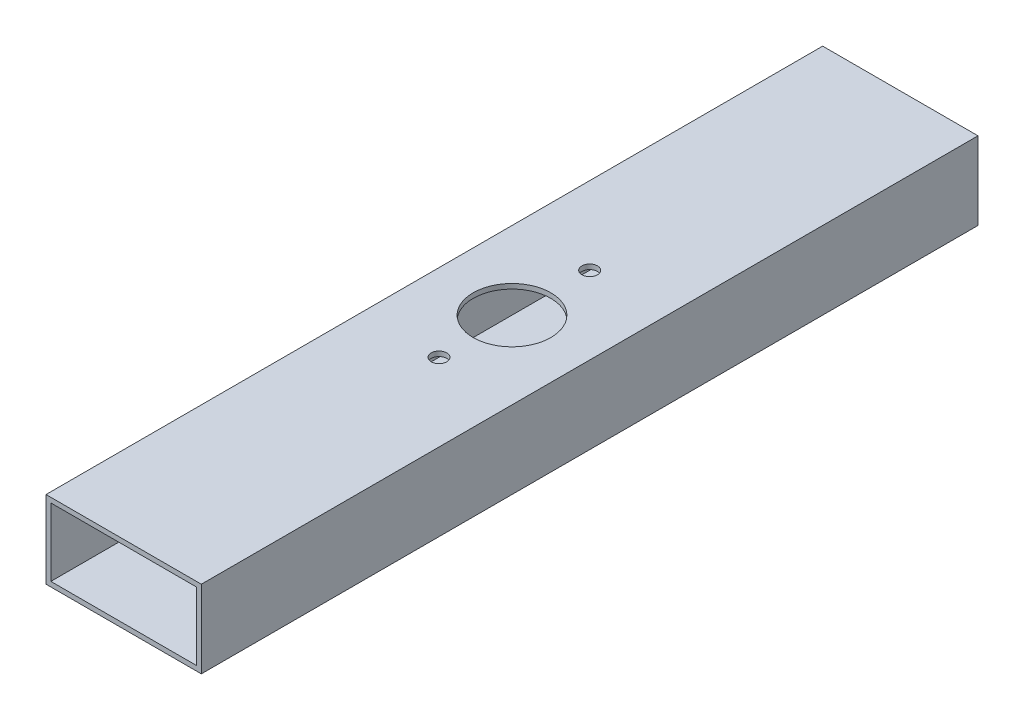
ISO-10303-21;
HEADER;
FILE_DESCRIPTION(('STEP AP214'),'2;1');
FILE_NAME('part.step','',(''),(''),'','','');
FILE_SCHEMA(('AUTOMOTIVE_DESIGN { 1 0 10303 214 1 1 1 1 }'));
ENDSEC;
DATA;
#1=APPLICATION_CONTEXT('core data for automotive mechanical design processes');
#2=APPLICATION_PROTOCOL_DEFINITION('international standard','automotive_design',2000,#1);
#3=PRODUCT_CONTEXT('',#1,'mechanical');
#4=PRODUCT('Part','Part','',(#3));
#5=PRODUCT_RELATED_PRODUCT_CATEGORY('part','',(#4));
#6=PRODUCT_DEFINITION_FORMATION('','',#4);
#7=PRODUCT_DEFINITION_CONTEXT('part definition',#1,'design');
#8=PRODUCT_DEFINITION('design','',#6,#7);
#9=PRODUCT_DEFINITION_SHAPE('','',#8);
#10=(LENGTH_UNIT() NAMED_UNIT(*) SI_UNIT(.MILLI.,.METRE.));
#11=(NAMED_UNIT(*) PLANE_ANGLE_UNIT() SI_UNIT($,.RADIAN.));
#12=(NAMED_UNIT(*) SI_UNIT($,.STERADIAN.) SOLID_ANGLE_UNIT());
#13=UNCERTAINTY_MEASURE_WITH_UNIT(LENGTH_MEASURE(1.E-05),#10,'distance_accuracy_value','');
#14=(GEOMETRIC_REPRESENTATION_CONTEXT(3) GLOBAL_UNCERTAINTY_ASSIGNED_CONTEXT((#13)) GLOBAL_UNIT_ASSIGNED_CONTEXT((#10,
#11,#12)) REPRESENTATION_CONTEXT('',''));
#15=CARTESIAN_POINT('',(0.,0.,0.));
#16=DIRECTION('',(0.,0.,1.));
#17=DIRECTION('',(1.,0.,0.));
#18=AXIS2_PLACEMENT_3D('',#15,#16,#17);
#19=CARTESIAN_POINT('',(0.,0.,254.));
#20=DIRECTION('',(0.,0.,1.));
#21=DIRECTION('',(1.,0.,0.));
#22=AXIS2_PLACEMENT_3D('',#19,#20,#21);
#23=PLANE('',#22);
#24=DIRECTION('',(0.,-1.,0.));
#25=VECTOR('',#24,1.);
#26=CARTESIAN_POINT('',(-25.4,-12.7,254.));
#27=LINE('',#26,#25);
#28=CARTESIAN_POINT('',(-25.4,12.7,254.));
#29=VERTEX_POINT('',#28);
#30=CARTESIAN_POINT('',(-25.4,-12.7,254.));
#31=VERTEX_POINT('',#30);
#32=EDGE_CURVE('E139',#29,#31,#27,.T.);
#33=ORIENTED_EDGE('',*,*,#32,.T.);
#34=DIRECTION('',(1.,0.,0.));
#35=VECTOR('',#34,1.);
#36=CARTESIAN_POINT('',(25.4,-12.7,254.));
#37=LINE('',#36,#35);
#38=CARTESIAN_POINT('',(25.4,-12.7,254.));
#39=VERTEX_POINT('',#38);
#40=EDGE_CURVE('E142',#31,#39,#37,.T.);
#41=ORIENTED_EDGE('',*,*,#40,.T.);
#42=DIRECTION('',(0.,1.,0.));
#43=VECTOR('',#42,1.);
#44=CARTESIAN_POINT('',(25.4,-12.7,254.));
#45=LINE('',#44,#43);
#46=CARTESIAN_POINT('',(25.4,12.7,254.));
#47=VERTEX_POINT('',#46);
#48=EDGE_CURVE('E145',#39,#47,#45,.T.);
#49=ORIENTED_EDGE('',*,*,#48,.T.);
#50=DIRECTION('',(-1.,0.,0.));
#51=VECTOR('',#50,1.);
#52=CARTESIAN_POINT('',(25.4,12.7,254.));
#53=LINE('',#52,#51);
#54=EDGE_CURVE('E147',#47,#29,#53,.T.);
#55=ORIENTED_EDGE('',*,*,#54,.T.);
#56=EDGE_LOOP('',(#33,#41,#49,#55));
#57=FACE_BOUND('',#56,.T.);
#58=DIRECTION('',(1.,0.,0.));
#59=VECTOR('',#58,1.);
#60=CARTESIAN_POINT('',(23.8125,-11.1125,254.));
#61=LINE('',#60,#59);
#62=CARTESIAN_POINT('',(-23.8125,-11.1125,254.));
#63=VERTEX_POINT('',#62);
#64=CARTESIAN_POINT('',(23.8125,-11.1125,254.));
#65=VERTEX_POINT('',#64);
#66=EDGE_CURVE('E109',#63,#65,#61,.T.);
#67=ORIENTED_EDGE('',*,*,#66,.F.);
#68=DIRECTION('',(0.,-1.,0.));
#69=VECTOR('',#68,1.);
#70=CARTESIAN_POINT('',(-23.8125,-11.1125,254.));
#71=LINE('',#70,#69);
#72=CARTESIAN_POINT('',(-23.8125,11.1125,254.));
#73=VERTEX_POINT('',#72);
#74=EDGE_CURVE('E101',#73,#63,#71,.T.);
#75=ORIENTED_EDGE('',*,*,#74,.F.);
#76=DIRECTION('',(-1.,0.,0.));
#77=VECTOR('',#76,1.);
#78=CARTESIAN_POINT('',(23.8125,11.1125,254.));
#79=LINE('',#78,#77);
#80=CARTESIAN_POINT('',(23.8125,11.1125,254.));
#81=VERTEX_POINT('',#80);
#82=EDGE_CURVE('E123',#81,#73,#79,.T.);
#83=ORIENTED_EDGE('',*,*,#82,.F.);
#84=DIRECTION('',(0.,1.,0.));
#85=VECTOR('',#84,1.);
#86=CARTESIAN_POINT('',(23.8125,-11.1125,254.));
#87=LINE('',#86,#85);
#88=EDGE_CURVE('E121',#65,#81,#87,.T.);
#89=ORIENTED_EDGE('',*,*,#88,.F.);
#90=EDGE_LOOP('',(#67,#75,#83,#89));
#91=FACE_BOUND('',#90,.T.);
#92=ADVANCED_FACE('F34',(#57,#91),#23,.T.);
#93=CARTESIAN_POINT('',(0.,0.,0.));
#94=DIRECTION('',(0.,0.,1.));
#95=DIRECTION('',(1.,0.,0.));
#96=AXIS2_PLACEMENT_3D('',#93,#94,#95);
#97=PLANE('',#96);
#98=DIRECTION('',(0.,-1.,0.));
#99=VECTOR('',#98,1.);
#100=CARTESIAN_POINT('',(-25.4,-12.7,0.));
#101=LINE('',#100,#99);
#102=CARTESIAN_POINT('',(-25.4,12.7,0.));
#103=VERTEX_POINT('',#102);
#104=CARTESIAN_POINT('',(-25.4,-12.7,0.));
#105=VERTEX_POINT('',#104);
#106=EDGE_CURVE('E117',#103,#105,#101,.T.);
#107=ORIENTED_EDGE('',*,*,#106,.F.);
#108=DIRECTION('',(-1.,0.,0.));
#109=VECTOR('',#108,1.);
#110=CARTESIAN_POINT('',(25.4,12.7,0.));
#111=LINE('',#110,#109);
#112=CARTESIAN_POINT('',(25.4,12.7,0.));
#113=VERTEX_POINT('',#112);
#114=EDGE_CURVE('E143',#113,#103,#111,.T.);
#115=ORIENTED_EDGE('',*,*,#114,.F.);
#116=DIRECTION('',(0.,1.,0.));
#117=VECTOR('',#116,1.);
#118=CARTESIAN_POINT('',(25.4,-12.7,0.));
#119=LINE('',#118,#117);
#120=CARTESIAN_POINT('',(25.4,-12.7,0.));
#121=VERTEX_POINT('',#120);
#122=EDGE_CURVE('E154',#121,#113,#119,.T.);
#123=ORIENTED_EDGE('',*,*,#122,.F.);
#124=DIRECTION('',(1.,0.,0.));
#125=VECTOR('',#124,1.);
#126=CARTESIAN_POINT('',(25.4,-12.7,0.));
#127=LINE('',#126,#125);
#128=EDGE_CURVE('E152',#105,#121,#127,.T.);
#129=ORIENTED_EDGE('',*,*,#128,.F.);
#130=EDGE_LOOP('',(#107,#115,#123,#129));
#131=FACE_BOUND('',#130,.T.);
#132=DIRECTION('',(0.,-1.,0.));
#133=VECTOR('',#132,1.);
#134=CARTESIAN_POINT('',(-23.8125,-11.1125,0.));
#135=LINE('',#134,#133);
#136=CARTESIAN_POINT('',(-23.8125,11.1125,0.));
#137=VERTEX_POINT('',#136);
#138=CARTESIAN_POINT('',(-23.8125,-11.1125,0.));
#139=VERTEX_POINT('',#138);
#140=EDGE_CURVE('E59',#137,#139,#135,.T.);
#141=ORIENTED_EDGE('',*,*,#140,.T.);
#142=DIRECTION('',(1.,0.,0.));
#143=VECTOR('',#142,1.);
#144=CARTESIAN_POINT('',(23.8125,-11.1125,0.));
#145=LINE('',#144,#143);
#146=CARTESIAN_POINT('',(23.8125,-11.1125,0.));
#147=VERTEX_POINT('',#146);
#148=EDGE_CURVE('E116',#139,#147,#145,.T.);
#149=ORIENTED_EDGE('',*,*,#148,.T.);
#150=DIRECTION('',(0.,1.,0.));
#151=VECTOR('',#150,1.);
#152=CARTESIAN_POINT('',(23.8125,-11.1125,0.));
#153=LINE('',#152,#151);
#154=CARTESIAN_POINT('',(23.8125,11.1125,0.));
#155=VERTEX_POINT('',#154);
#156=EDGE_CURVE('E131',#147,#155,#153,.T.);
#157=ORIENTED_EDGE('',*,*,#156,.T.);
#158=DIRECTION('',(-1.,0.,0.));
#159=VECTOR('',#158,1.);
#160=CARTESIAN_POINT('',(23.8125,11.1125,0.));
#161=LINE('',#160,#159);
#162=EDGE_CURVE('E110',#155,#137,#161,.T.);
#163=ORIENTED_EDGE('',*,*,#162,.T.);
#164=EDGE_LOOP('',(#141,#149,#157,#163));
#165=FACE_BOUND('',#164,.T.);
#166=ADVANCED_FACE('F201',(#131,#165),#97,.F.);
#167=CARTESIAN_POINT('',(-25.4,-12.7,254.));
#168=DIRECTION('',(1.,0.,0.));
#169=DIRECTION('',(0.,0.,-1.));
#170=AXIS2_PLACEMENT_3D('',#167,#168,#169);
#171=PLANE('',#170);
#172=ORIENTED_EDGE('',*,*,#106,.T.);
#173=DIRECTION('',(0.,0.,-1.));
#174=VECTOR('',#173,1.);
#175=CARTESIAN_POINT('',(-25.4,-12.7,254.));
#176=LINE('',#175,#174);
#177=EDGE_CURVE('E11',#31,#105,#176,.T.);
#178=ORIENTED_EDGE('',*,*,#177,.F.);
#179=ORIENTED_EDGE('',*,*,#32,.F.);
#180=DIRECTION('',(0.,0.,-1.));
#181=VECTOR('',#180,1.);
#182=CARTESIAN_POINT('',(-25.4,12.7,254.));
#183=LINE('',#182,#181);
#184=EDGE_CURVE('E149',#29,#103,#183,.T.);
#185=ORIENTED_EDGE('',*,*,#184,.T.);
#186=EDGE_LOOP('',(#172,#178,#179,#185));
#187=FACE_BOUND('',#186,.T.);
#188=ADVANCED_FACE('F36',(#187),#171,.F.);
#189=CARTESIAN_POINT('',(25.4,-12.7,254.));
#190=DIRECTION('',(0.,1.,0.));
#191=DIRECTION('',(-1.,0.,0.));
#192=AXIS2_PLACEMENT_3D('',#189,#190,#191);
#193=PLANE('',#192);
#194=CARTESIAN_POINT('',(0.,-12.7,150.876));
#195=DIRECTION('',(0.,1.,0.));
#196=DIRECTION('',(-1.,0.,0.));
#197=AXIS2_PLACEMENT_3D('',#194,#195,#196);
#198=CIRCLE('',#197,2.54);
#199=CARTESIAN_POINT('',(-2.53999999999998,-12.7,150.876));
#200=VERTEX_POINT('',#199);
#201=EDGE_CURVE('E237',#200,#200,#198,.T.);
#202=ORIENTED_EDGE('',*,*,#201,.T.);
#203=EDGE_LOOP('',(#202));
#204=FACE_BOUND('',#203,.T.);
#205=CARTESIAN_POINT('',(0.,-12.7,101.6));
#206=DIRECTION('',(0.,1.,0.));
#207=DIRECTION('',(-1.,0.,0.));
#208=AXIS2_PLACEMENT_3D('',#205,#206,#207);
#209=CIRCLE('',#208,2.54);
#210=CARTESIAN_POINT('',(-2.53999999999998,-12.7,101.6));
#211=VERTEX_POINT('',#210);
#212=EDGE_CURVE('E241',#211,#211,#209,.T.);
#213=ORIENTED_EDGE('',*,*,#212,.T.);
#214=EDGE_LOOP('',(#213));
#215=FACE_BOUND('',#214,.T.);
#216=CARTESIAN_POINT('',(0.,-12.7,127.));
#217=DIRECTION('',(0.,1.,0.));
#218=DIRECTION('',(-1.,0.,0.));
#219=AXIS2_PLACEMENT_3D('',#216,#217,#218);
#220=CIRCLE('',#219,12.7);
#221=CARTESIAN_POINT('',(-12.7,-12.7,127.));
#222=VERTEX_POINT('',#221);
#223=EDGE_CURVE('E167',#222,#222,#220,.T.);
#224=ORIENTED_EDGE('',*,*,#223,.T.);
#225=EDGE_LOOP('',(#224));
#226=FACE_BOUND('',#225,.T.);
#227=ORIENTED_EDGE('',*,*,#128,.T.);
#228=DIRECTION('',(0.,0.,-1.));
#229=VECTOR('',#228,1.);
#230=CARTESIAN_POINT('',(25.4,-12.7,254.));
#231=LINE('',#230,#229);
#232=EDGE_CURVE('E43',#39,#121,#231,.T.);
#233=ORIENTED_EDGE('',*,*,#232,.F.);
#234=ORIENTED_EDGE('',*,*,#40,.F.);
#235=ORIENTED_EDGE('',*,*,#177,.T.);
#236=EDGE_LOOP('',(#227,#233,#234,#235));
#237=FACE_BOUND('',#236,.T.);
#238=ADVANCED_FACE('F226',(#204,#215,#226,#237),#193,.F.);
#239=CARTESIAN_POINT('',(25.4,-12.7,254.));
#240=DIRECTION('',(-1.,0.,0.));
#241=DIRECTION('',(0.,-1.,0.));
#242=AXIS2_PLACEMENT_3D('',#239,#240,#241);
#243=PLANE('',#242);
#244=ORIENTED_EDGE('',*,*,#122,.T.);
#245=DIRECTION('',(0.,0.,-1.));
#246=VECTOR('',#245,1.);
#247=CARTESIAN_POINT('',(25.4,12.7,254.));
#248=LINE('',#247,#246);
#249=EDGE_CURVE('E159',#47,#113,#248,.T.);
#250=ORIENTED_EDGE('',*,*,#249,.F.);
#251=ORIENTED_EDGE('',*,*,#48,.F.);
#252=ORIENTED_EDGE('',*,*,#232,.T.);
#253=EDGE_LOOP('',(#244,#250,#251,#252));
#254=FACE_BOUND('',#253,.T.);
#255=ADVANCED_FACE('F223',(#254),#243,.F.);
#256=CARTESIAN_POINT('',(25.4,12.7,254.));
#257=DIRECTION('',(0.,-1.,0.));
#258=DIRECTION('',(1.,0.,0.));
#259=AXIS2_PLACEMENT_3D('',#256,#257,#258);
#260=PLANE('',#259);
#261=CARTESIAN_POINT('',(0.,12.7,150.876));
#262=DIRECTION('',(0.,1.,0.));
#263=DIRECTION('',(-1.,0.,0.));
#264=AXIS2_PLACEMENT_3D('',#261,#262,#263);
#265=CIRCLE('',#264,2.54);
#266=CARTESIAN_POINT('',(-2.53999999999999,12.7,150.876));
#267=VERTEX_POINT('',#266);
#268=EDGE_CURVE('E259',#267,#267,#265,.T.);
#269=ORIENTED_EDGE('',*,*,#268,.F.);
#270=EDGE_LOOP('',(#269));
#271=FACE_BOUND('',#270,.T.);
#272=CARTESIAN_POINT('',(0.,12.7,101.6));
#273=DIRECTION('',(0.,1.,0.));
#274=DIRECTION('',(-1.,0.,0.));
#275=AXIS2_PLACEMENT_3D('',#272,#273,#274);
#276=CIRCLE('',#275,2.54);
#277=CARTESIAN_POINT('',(-2.53999999999999,12.7,101.6));
#278=VERTEX_POINT('',#277);
#279=EDGE_CURVE('E263',#278,#278,#276,.T.);
#280=ORIENTED_EDGE('',*,*,#279,.F.);
#281=EDGE_LOOP('',(#280));
#282=FACE_BOUND('',#281,.T.);
#283=CARTESIAN_POINT('',(0.,12.7,127.));
#284=DIRECTION('',(0.,1.,0.));
#285=DIRECTION('',(-1.,0.,0.));
#286=AXIS2_PLACEMENT_3D('',#283,#284,#285);
#287=CIRCLE('',#286,12.7);
#288=CARTESIAN_POINT('',(-12.7,12.7,127.));
#289=VERTEX_POINT('',#288);
#290=EDGE_CURVE('E180',#289,#289,#287,.T.);
#291=ORIENTED_EDGE('',*,*,#290,.F.);
#292=EDGE_LOOP('',(#291));
#293=FACE_BOUND('',#292,.T.);
#294=ORIENTED_EDGE('',*,*,#114,.T.);
#295=ORIENTED_EDGE('',*,*,#184,.F.);
#296=ORIENTED_EDGE('',*,*,#54,.F.);
#297=ORIENTED_EDGE('',*,*,#249,.T.);
#298=EDGE_LOOP('',(#294,#295,#296,#297));
#299=FACE_BOUND('',#298,.T.);
#300=ADVANCED_FACE('F220',(#271,#282,#293,#299),#260,.F.);
#301=CARTESIAN_POINT('',(-23.8125,-11.1125,254.));
#302=DIRECTION('',(1.,0.,0.));
#303=DIRECTION('',(0.,0.,-1.));
#304=AXIS2_PLACEMENT_3D('',#301,#302,#303);
#305=PLANE('',#304);
#306=ORIENTED_EDGE('',*,*,#140,.F.);
#307=DIRECTION('',(0.,0.,-1.));
#308=VECTOR('',#307,1.);
#309=CARTESIAN_POINT('',(-23.8125,11.1125,254.));
#310=LINE('',#309,#308);
#311=EDGE_CURVE('E105',#73,#137,#310,.T.);
#312=ORIENTED_EDGE('',*,*,#311,.F.);
#313=ORIENTED_EDGE('',*,*,#74,.T.);
#314=DIRECTION('',(0.,0.,-1.));
#315=VECTOR('',#314,1.);
#316=CARTESIAN_POINT('',(-23.8125,-11.1125,254.));
#317=LINE('',#316,#315);
#318=EDGE_CURVE('E104',#63,#139,#317,.T.);
#319=ORIENTED_EDGE('',*,*,#318,.T.);
#320=EDGE_LOOP('',(#306,#312,#313,#319));
#321=FACE_BOUND('',#320,.T.);
#322=ADVANCED_FACE('F103',(#321),#305,.T.);
#323=CARTESIAN_POINT('',(23.8125,-11.1125,254.));
#324=DIRECTION('',(0.,1.,0.));
#325=DIRECTION('',(-1.,0.,0.));
#326=AXIS2_PLACEMENT_3D('',#323,#324,#325);
#327=PLANE('',#326);
#328=CARTESIAN_POINT('',(0.,-11.1125,150.876));
#329=DIRECTION('',(0.,1.,0.));
#330=DIRECTION('',(-1.,0.,0.));
#331=AXIS2_PLACEMENT_3D('',#328,#329,#330);
#332=CIRCLE('',#331,2.54);
#333=CARTESIAN_POINT('',(-2.53999999999998,-11.1125,150.876));
#334=VERTEX_POINT('',#333);
#335=EDGE_CURVE('E129',#334,#334,#332,.T.);
#336=ORIENTED_EDGE('',*,*,#335,.F.);
#337=EDGE_LOOP('',(#336));
#338=FACE_BOUND('',#337,.T.);
#339=CARTESIAN_POINT('',(0.,-11.1125,101.6));
#340=DIRECTION('',(0.,1.,0.));
#341=DIRECTION('',(-1.,0.,0.));
#342=AXIS2_PLACEMENT_3D('',#339,#340,#341);
#343=CIRCLE('',#342,2.54);
#344=CARTESIAN_POINT('',(-2.53999999999998,-11.1125,101.6));
#345=VERTEX_POINT('',#344);
#346=EDGE_CURVE('E170',#345,#345,#343,.T.);
#347=ORIENTED_EDGE('',*,*,#346,.F.);
#348=EDGE_LOOP('',(#347));
#349=FACE_BOUND('',#348,.T.);
#350=CARTESIAN_POINT('',(0.,-11.1125,127.));
#351=DIRECTION('',(0.,1.,0.));
#352=DIRECTION('',(-1.,0.,0.));
#353=AXIS2_PLACEMENT_3D('',#350,#351,#352);
#354=CIRCLE('',#353,12.7);
#355=CARTESIAN_POINT('',(-12.7,-11.1125,127.));
#356=VERTEX_POINT('',#355);
#357=EDGE_CURVE('E166',#356,#356,#354,.T.);
#358=ORIENTED_EDGE('',*,*,#357,.F.);
#359=EDGE_LOOP('',(#358));
#360=FACE_BOUND('',#359,.T.);
#361=ORIENTED_EDGE('',*,*,#148,.F.);
#362=ORIENTED_EDGE('',*,*,#318,.F.);
#363=ORIENTED_EDGE('',*,*,#66,.T.);
#364=DIRECTION('',(0.,0.,-1.));
#365=VECTOR('',#364,1.);
#366=CARTESIAN_POINT('',(23.8125,-11.1125,254.));
#367=LINE('',#366,#365);
#368=EDGE_CURVE('E118',#65,#147,#367,.T.);
#369=ORIENTED_EDGE('',*,*,#368,.T.);
#370=EDGE_LOOP('',(#361,#362,#363,#369));
#371=FACE_BOUND('',#370,.T.);
#372=ADVANCED_FACE('F113',(#338,#349,#360,#371),#327,.T.);
#373=CARTESIAN_POINT('',(23.8125,-11.1125,254.));
#374=DIRECTION('',(-1.,0.,0.));
#375=DIRECTION('',(0.,0.,1.));
#376=AXIS2_PLACEMENT_3D('',#373,#374,#375);
#377=PLANE('',#376);
#378=ORIENTED_EDGE('',*,*,#156,.F.);
#379=ORIENTED_EDGE('',*,*,#368,.F.);
#380=ORIENTED_EDGE('',*,*,#88,.T.);
#381=DIRECTION('',(0.,0.,-1.));
#382=VECTOR('',#381,1.);
#383=CARTESIAN_POINT('',(23.8125,11.1125,254.));
#384=LINE('',#383,#382);
#385=EDGE_CURVE('E51',#81,#155,#384,.T.);
#386=ORIENTED_EDGE('',*,*,#385,.T.);
#387=EDGE_LOOP('',(#378,#379,#380,#386));
#388=FACE_BOUND('',#387,.T.);
#389=ADVANCED_FACE('F195',(#388),#377,.T.);
#390=CARTESIAN_POINT('',(23.8125,11.1125,254.));
#391=DIRECTION('',(0.,-1.,0.));
#392=DIRECTION('',(1.,0.,0.));
#393=AXIS2_PLACEMENT_3D('',#390,#391,#392);
#394=PLANE('',#393);
#395=CARTESIAN_POINT('',(0.,11.1125,150.876));
#396=DIRECTION('',(0.,-1.,0.));
#397=DIRECTION('',(1.,0.,0.));
#398=AXIS2_PLACEMENT_3D('',#395,#396,#397);
#399=CIRCLE('',#398,2.54);
#400=CARTESIAN_POINT('',(-2.53999999999999,11.1125,150.876));
#401=VERTEX_POINT('',#400);
#402=EDGE_CURVE('E38',#401,#401,#399,.T.);
#403=ORIENTED_EDGE('',*,*,#402,.F.);
#404=EDGE_LOOP('',(#403));
#405=FACE_BOUND('',#404,.T.);
#406=CARTESIAN_POINT('',(0.,11.1125,101.6));
#407=DIRECTION('',(0.,-1.,0.));
#408=DIRECTION('',(1.,0.,0.));
#409=AXIS2_PLACEMENT_3D('',#406,#407,#408);
#410=CIRCLE('',#409,2.54);
#411=CARTESIAN_POINT('',(-2.53999999999999,11.1125,101.6));
#412=VERTEX_POINT('',#411);
#413=EDGE_CURVE('E168',#412,#412,#410,.T.);
#414=ORIENTED_EDGE('',*,*,#413,.F.);
#415=EDGE_LOOP('',(#414));
#416=FACE_BOUND('',#415,.T.);
#417=CARTESIAN_POINT('',(0.,11.1125,127.));
#418=DIRECTION('',(0.,-1.,0.));
#419=DIRECTION('',(1.,0.,0.));
#420=AXIS2_PLACEMENT_3D('',#417,#418,#419);
#421=CIRCLE('',#420,12.7);
#422=CARTESIAN_POINT('',(-12.7,11.1125,127.));
#423=VERTEX_POINT('',#422);
#424=EDGE_CURVE('E164',#423,#423,#421,.T.);
#425=ORIENTED_EDGE('',*,*,#424,.F.);
#426=EDGE_LOOP('',(#425));
#427=FACE_BOUND('',#426,.T.);
#428=ORIENTED_EDGE('',*,*,#162,.F.);
#429=ORIENTED_EDGE('',*,*,#385,.F.);
#430=ORIENTED_EDGE('',*,*,#82,.T.);
#431=ORIENTED_EDGE('',*,*,#311,.T.);
#432=EDGE_LOOP('',(#428,#429,#430,#431));
#433=FACE_BOUND('',#432,.T.);
#434=ADVANCED_FACE('F191',(#405,#416,#427,#433),#394,.T.);
#435=CARTESIAN_POINT('',(0.,-12.7,127.));
#436=DIRECTION('',(0.,1.,0.));
#437=DIRECTION('',(-1.,0.,0.));
#438=AXIS2_PLACEMENT_3D('',#435,#436,#437);
#439=CYLINDRICAL_SURFACE('',#438,12.7);
#440=CARTESIAN_POINT('',(-12.7,11.1125,127.));
#441=CARTESIAN_POINT('',(-12.7,11.1290364583333,127.));
#442=CARTESIAN_POINT('',(-12.7,11.1455729166667,127.));
#443=CARTESIAN_POINT('',(-12.7,11.1786458333333,127.));
#444=CARTESIAN_POINT('',(-12.7,11.1951822916667,127.));
#445=CARTESIAN_POINT('',(-12.7,11.2282552083333,127.));
#446=CARTESIAN_POINT('',(-12.7,11.2447916666667,127.));
#447=CARTESIAN_POINT('',(-12.7,11.2778645833333,127.));
#448=CARTESIAN_POINT('',(-12.7,11.2944010416667,127.));
#449=CARTESIAN_POINT('',(-12.7,11.3274739583333,127.));
#450=CARTESIAN_POINT('',(-12.7,11.3440104166667,127.));
#451=CARTESIAN_POINT('',(-12.7,11.3770833333333,127.));
#452=CARTESIAN_POINT('',(-12.7,11.3936197916667,127.));
#453=CARTESIAN_POINT('',(-12.7,11.4266927083333,127.));
#454=CARTESIAN_POINT('',(-12.7,11.4432291666667,127.));
#455=CARTESIAN_POINT('',(-12.7,11.4763020833333,127.));
#456=CARTESIAN_POINT('',(-12.7,11.4928385416667,127.));
#457=CARTESIAN_POINT('',(-12.7,11.5259114583333,127.));
#458=CARTESIAN_POINT('',(-12.7,11.5424479166667,127.));
#459=CARTESIAN_POINT('',(-12.7,11.5755208333333,127.));
#460=CARTESIAN_POINT('',(-12.7,11.5920572916667,127.));
#461=CARTESIAN_POINT('',(-12.7,11.6251302083333,127.));
#462=CARTESIAN_POINT('',(-12.7,11.6416666666667,127.));
#463=CARTESIAN_POINT('',(-12.7,11.6747395833333,127.));
#464=CARTESIAN_POINT('',(-12.7,11.6912760416667,127.));
#465=CARTESIAN_POINT('',(-12.7,11.7243489583333,127.));
#466=CARTESIAN_POINT('',(-12.7,11.7408854166667,127.));
#467=CARTESIAN_POINT('',(-12.7,11.7739583333333,127.));
#468=CARTESIAN_POINT('',(-12.7,11.7904947916667,127.));
#469=CARTESIAN_POINT('',(-12.7,11.8235677083333,127.));
#470=CARTESIAN_POINT('',(-12.7,11.8401041666667,127.));
#471=CARTESIAN_POINT('',(-12.7,11.8731770833333,127.));
#472=CARTESIAN_POINT('',(-12.7,11.8897135416667,127.));
#473=CARTESIAN_POINT('',(-12.7,11.9227864583333,127.));
#474=CARTESIAN_POINT('',(-12.7,11.9393229166667,127.));
#475=CARTESIAN_POINT('',(-12.7,11.9723958333333,127.));
#476=CARTESIAN_POINT('',(-12.7,11.9889322916667,127.));
#477=CARTESIAN_POINT('',(-12.7,12.0220052083333,127.));
#478=CARTESIAN_POINT('',(-12.7,12.0385416666667,127.));
#479=CARTESIAN_POINT('',(-12.7,12.0716145833333,127.));
#480=CARTESIAN_POINT('',(-12.7,12.0881510416667,127.));
#481=CARTESIAN_POINT('',(-12.7,12.1212239583333,127.));
#482=CARTESIAN_POINT('',(-12.7,12.1377604166667,127.));
#483=CARTESIAN_POINT('',(-12.7,12.1708333333333,127.));
#484=CARTESIAN_POINT('',(-12.7,12.1873697916667,127.));
#485=CARTESIAN_POINT('',(-12.7,12.2204427083333,127.));
#486=CARTESIAN_POINT('',(-12.7,12.2369791666667,127.));
#487=CARTESIAN_POINT('',(-12.7,12.2700520833333,127.));
#488=CARTESIAN_POINT('',(-12.7,12.2865885416667,127.));
#489=CARTESIAN_POINT('',(-12.7,12.3196614583333,127.));
#490=CARTESIAN_POINT('',(-12.7,12.3361979166667,127.));
#491=CARTESIAN_POINT('',(-12.7,12.3692708333333,127.));
#492=CARTESIAN_POINT('',(-12.7,12.3858072916667,127.));
#493=CARTESIAN_POINT('',(-12.7,12.4188802083333,127.));
#494=CARTESIAN_POINT('',(-12.7,12.4354166666667,127.));
#495=CARTESIAN_POINT('',(-12.7,12.4684895833333,127.));
#496=CARTESIAN_POINT('',(-12.7,12.4850260416667,127.));
#497=CARTESIAN_POINT('',(-12.7,12.5180989583333,127.));
#498=CARTESIAN_POINT('',(-12.7,12.5346354166667,127.));
#499=CARTESIAN_POINT('',(-12.7,12.5677083333333,127.));
#500=CARTESIAN_POINT('',(-12.7,12.5842447916667,127.));
#501=CARTESIAN_POINT('',(-12.7,12.6173177083333,127.));
#502=CARTESIAN_POINT('',(-12.7,12.6338541666667,127.));
#503=CARTESIAN_POINT('',(-12.7,12.6669270833333,127.));
#504=CARTESIAN_POINT('',(-12.7,12.6834635416667,127.));
#505=CARTESIAN_POINT('',(-12.7,12.7,127.));
#506=B_SPLINE_CURVE_WITH_KNOTS('',3,(#440,#441,#442,#443,#444,#445,#446,#447,#448,#449,#450,
#451,#452,#453,#454,#455,#456,#457,#458,#459,#460,#461,#462,#463,#464,#465,#466,#467,#468,#469,
#470,#471,#472,#473,#474,#475,#476,#477,#478,#479,#480,#481,#482,#483,#484,#485,#486,#487,#488,
#489,#490,#491,#492,#493,#494,#495,#496,#497,#498,#499,#500,#501,#502,#503,#504,#505),
.UNSPECIFIED.,.F.,.F.,(4,2,2,2,2,2,2,2,2,2,2,2,2,2,2,2,2,2,2,2,2,2,2,2,2,2,2,2,2,2,2,2,4),(0.,
0.0496093749999989,0.0992187499999977,0.148828125,0.198437499999999,0.248046874999998,
0.29765625,0.347265624999999,0.396874999999998,0.446484374999997,0.496093749999996,
0.545703124999998,0.595312499999997,0.644921874999996,0.694531249999998,0.744140624999997,
0.793749999999996,0.843359374999995,0.892968749999994,0.942578124999996,0.992187499999995,
1.04179687499999,1.09140625,1.14101562499999,1.19062499999999,1.24023437499999,1.28984374999999,
1.33945312499999,1.38906249999999,1.43867187499999,1.48828124999999,1.53789062499999,
1.58749999999999),.UNSPECIFIED.);
#507=EDGE_CURVE('BSEAM194',#423,#289,#506,.T.);
#508=ORIENTED_EDGE('',*,*,#424,.T.);
#509=ORIENTED_EDGE('',*,*,#290,.T.);
#510=ORIENTED_EDGE('',*,*,#507,.T.);
#511=ORIENTED_EDGE('',*,*,#507,.F.);
#512=EDGE_LOOP('',(#508,#510,#509,#511));
#513=FACE_BOUND('',#512,.T.);
#514=ADVANCED_FACE('F194',(#513),#439,.F.);
#515=CARTESIAN_POINT('',(0.,-12.7,101.6));
#516=DIRECTION('',(0.,1.,0.));
#517=DIRECTION('',(-1.,0.,0.));
#518=AXIS2_PLACEMENT_3D('',#515,#516,#517);
#519=CYLINDRICAL_SURFACE('',#518,2.54);
#520=CARTESIAN_POINT('',(-2.53999999999999,11.1125,101.6));
#521=CARTESIAN_POINT('',(-2.53999999999999,11.1290364583333,101.6));
#522=CARTESIAN_POINT('',(-2.53999999999999,11.1455729166667,101.6));
#523=CARTESIAN_POINT('',(-2.53999999999999,11.1786458333333,101.6));
#524=CARTESIAN_POINT('',(-2.53999999999999,11.1951822916667,101.6));
#525=CARTESIAN_POINT('',(-2.53999999999999,11.2282552083333,101.6));
#526=CARTESIAN_POINT('',(-2.53999999999999,11.2447916666667,101.6));
#527=CARTESIAN_POINT('',(-2.53999999999999,11.2778645833333,101.6));
#528=CARTESIAN_POINT('',(-2.53999999999999,11.2944010416667,101.6));
#529=CARTESIAN_POINT('',(-2.53999999999999,11.3274739583333,101.6));
#530=CARTESIAN_POINT('',(-2.53999999999999,11.3440104166667,101.6));
#531=CARTESIAN_POINT('',(-2.53999999999999,11.3770833333333,101.6));
#532=CARTESIAN_POINT('',(-2.53999999999999,11.3936197916667,101.6));
#533=CARTESIAN_POINT('',(-2.53999999999999,11.4266927083333,101.6));
#534=CARTESIAN_POINT('',(-2.53999999999999,11.4432291666667,101.6));
#535=CARTESIAN_POINT('',(-2.53999999999999,11.4763020833333,101.6));
#536=CARTESIAN_POINT('',(-2.53999999999999,11.4928385416667,101.6));
#537=CARTESIAN_POINT('',(-2.53999999999999,11.5259114583333,101.6));
#538=CARTESIAN_POINT('',(-2.53999999999999,11.5424479166667,101.6));
#539=CARTESIAN_POINT('',(-2.53999999999999,11.5755208333333,101.6));
#540=CARTESIAN_POINT('',(-2.53999999999999,11.5920572916667,101.6));
#541=CARTESIAN_POINT('',(-2.53999999999999,11.6251302083333,101.6));
#542=CARTESIAN_POINT('',(-2.53999999999999,11.6416666666667,101.6));
#543=CARTESIAN_POINT('',(-2.53999999999999,11.6747395833333,101.6));
#544=CARTESIAN_POINT('',(-2.53999999999999,11.6912760416667,101.6));
#545=CARTESIAN_POINT('',(-2.53999999999999,11.7243489583333,101.6));
#546=CARTESIAN_POINT('',(-2.53999999999999,11.7408854166667,101.6));
#547=CARTESIAN_POINT('',(-2.53999999999999,11.7739583333333,101.6));
#548=CARTESIAN_POINT('',(-2.53999999999999,11.7904947916667,101.6));
#549=CARTESIAN_POINT('',(-2.53999999999999,11.8235677083333,101.6));
#550=CARTESIAN_POINT('',(-2.53999999999999,11.8401041666667,101.6));
#551=CARTESIAN_POINT('',(-2.53999999999999,11.8731770833333,101.6));
#552=CARTESIAN_POINT('',(-2.53999999999999,11.8897135416667,101.6));
#553=CARTESIAN_POINT('',(-2.53999999999999,11.9227864583333,101.6));
#554=CARTESIAN_POINT('',(-2.53999999999999,11.9393229166667,101.6));
#555=CARTESIAN_POINT('',(-2.53999999999999,11.9723958333333,101.6));
#556=CARTESIAN_POINT('',(-2.53999999999999,11.9889322916667,101.6));
#557=CARTESIAN_POINT('',(-2.53999999999999,12.0220052083333,101.6));
#558=CARTESIAN_POINT('',(-2.53999999999999,12.0385416666667,101.6));
#559=CARTESIAN_POINT('',(-2.53999999999999,12.0716145833333,101.6));
#560=CARTESIAN_POINT('',(-2.53999999999999,12.0881510416667,101.6));
#561=CARTESIAN_POINT('',(-2.53999999999999,12.1212239583333,101.6));
#562=CARTESIAN_POINT('',(-2.53999999999999,12.1377604166667,101.6));
#563=CARTESIAN_POINT('',(-2.53999999999999,12.1708333333333,101.6));
#564=CARTESIAN_POINT('',(-2.53999999999999,12.1873697916667,101.6));
#565=CARTESIAN_POINT('',(-2.53999999999999,12.2204427083333,101.6));
#566=CARTESIAN_POINT('',(-2.53999999999999,12.2369791666667,101.6));
#567=CARTESIAN_POINT('',(-2.53999999999999,12.2700520833333,101.6));
#568=CARTESIAN_POINT('',(-2.53999999999999,12.2865885416667,101.6));
#569=CARTESIAN_POINT('',(-2.53999999999999,12.3196614583333,101.6));
#570=CARTESIAN_POINT('',(-2.53999999999999,12.3361979166667,101.6));
#571=CARTESIAN_POINT('',(-2.53999999999999,12.3692708333333,101.6));
#572=CARTESIAN_POINT('',(-2.53999999999999,12.3858072916667,101.6));
#573=CARTESIAN_POINT('',(-2.53999999999999,12.4188802083333,101.6));
#574=CARTESIAN_POINT('',(-2.53999999999999,12.4354166666667,101.6));
#575=CARTESIAN_POINT('',(-2.53999999999999,12.4684895833333,101.6));
#576=CARTESIAN_POINT('',(-2.53999999999999,12.4850260416667,101.6));
#577=CARTESIAN_POINT('',(-2.53999999999999,12.5180989583333,101.6));
#578=CARTESIAN_POINT('',(-2.53999999999999,12.5346354166667,101.6));
#579=CARTESIAN_POINT('',(-2.53999999999999,12.5677083333333,101.6));
#580=CARTESIAN_POINT('',(-2.53999999999999,12.5842447916667,101.6));
#581=CARTESIAN_POINT('',(-2.53999999999999,12.6173177083333,101.6));
#582=CARTESIAN_POINT('',(-2.53999999999999,12.6338541666667,101.6));
#583=CARTESIAN_POINT('',(-2.53999999999999,12.6669270833333,101.6));
#584=CARTESIAN_POINT('',(-2.53999999999999,12.6834635416667,101.6));
#585=CARTESIAN_POINT('',(-2.53999999999999,12.7,101.6));
#586=B_SPLINE_CURVE_WITH_KNOTS('',3,(#520,#521,#522,#523,#524,#525,#526,#527,#528,#529,#530,
#531,#532,#533,#534,#535,#536,#537,#538,#539,#540,#541,#542,#543,#544,#545,#546,#547,#548,#549,
#550,#551,#552,#553,#554,#555,#556,#557,#558,#559,#560,#561,#562,#563,#564,#565,#566,#567,#568,
#569,#570,#571,#572,#573,#574,#575,#576,#577,#578,#579,#580,#581,#582,#583,#584,#585),
.UNSPECIFIED.,.F.,.F.,(4,2,2,2,2,2,2,2,2,2,2,2,2,2,2,2,2,2,2,2,2,2,2,2,2,2,2,2,2,2,2,2,4),(0.,
0.0496093749999989,0.0992187499999977,0.148828125,0.198437499999999,0.248046874999998,
0.29765625,0.347265624999999,0.396874999999998,0.446484374999997,0.496093749999996,
0.545703124999998,0.595312499999997,0.644921874999996,0.694531249999998,0.744140624999997,
0.793749999999996,0.843359374999995,0.892968749999994,0.942578124999996,0.992187499999995,
1.04179687499999,1.09140625,1.14101562499999,1.19062499999999,1.24023437499999,1.28984374999999,
1.33945312499999,1.38906249999999,1.43867187499999,1.48828124999999,1.53789062499999,
1.58749999999999),.UNSPECIFIED.);
#587=EDGE_CURVE('BSEAM268',#412,#278,#586,.T.);
#588=ORIENTED_EDGE('',*,*,#413,.T.);
#589=ORIENTED_EDGE('',*,*,#279,.T.);
#590=ORIENTED_EDGE('',*,*,#587,.T.);
#591=ORIENTED_EDGE('',*,*,#587,.F.);
#592=EDGE_LOOP('',(#588,#590,#589,#591));
#593=FACE_BOUND('',#592,.T.);
#594=ADVANCED_FACE('F268',(#593),#519,.F.);
#595=CARTESIAN_POINT('',(0.,-12.7,150.876));
#596=DIRECTION('',(0.,1.,0.));
#597=DIRECTION('',(-1.,0.,0.));
#598=AXIS2_PLACEMENT_3D('',#595,#596,#597);
#599=CYLINDRICAL_SURFACE('',#598,2.54);
#600=CARTESIAN_POINT('',(-2.53999999999999,11.1125,150.876));
#601=CARTESIAN_POINT('',(-2.53999999999999,11.1290364583333,150.876));
#602=CARTESIAN_POINT('',(-2.53999999999999,11.1455729166667,150.876));
#603=CARTESIAN_POINT('',(-2.53999999999999,11.1786458333333,150.876));
#604=CARTESIAN_POINT('',(-2.53999999999999,11.1951822916667,150.876));
#605=CARTESIAN_POINT('',(-2.53999999999999,11.2282552083333,150.876));
#606=CARTESIAN_POINT('',(-2.53999999999999,11.2447916666667,150.876));
#607=CARTESIAN_POINT('',(-2.53999999999999,11.2778645833333,150.876));
#608=CARTESIAN_POINT('',(-2.53999999999999,11.2944010416667,150.876));
#609=CARTESIAN_POINT('',(-2.53999999999999,11.3274739583333,150.876));
#610=CARTESIAN_POINT('',(-2.53999999999999,11.3440104166667,150.876));
#611=CARTESIAN_POINT('',(-2.53999999999999,11.3770833333333,150.876));
#612=CARTESIAN_POINT('',(-2.53999999999999,11.3936197916667,150.876));
#613=CARTESIAN_POINT('',(-2.53999999999999,11.4266927083333,150.876));
#614=CARTESIAN_POINT('',(-2.53999999999999,11.4432291666667,150.876));
#615=CARTESIAN_POINT('',(-2.53999999999999,11.4763020833333,150.876));
#616=CARTESIAN_POINT('',(-2.53999999999999,11.4928385416667,150.876));
#617=CARTESIAN_POINT('',(-2.53999999999999,11.5259114583333,150.876));
#618=CARTESIAN_POINT('',(-2.53999999999999,11.5424479166667,150.876));
#619=CARTESIAN_POINT('',(-2.53999999999999,11.5755208333333,150.876));
#620=CARTESIAN_POINT('',(-2.53999999999999,11.5920572916667,150.876));
#621=CARTESIAN_POINT('',(-2.53999999999999,11.6251302083333,150.876));
#622=CARTESIAN_POINT('',(-2.53999999999999,11.6416666666667,150.876));
#623=CARTESIAN_POINT('',(-2.53999999999999,11.6747395833333,150.876));
#624=CARTESIAN_POINT('',(-2.53999999999999,11.6912760416667,150.876));
#625=CARTESIAN_POINT('',(-2.53999999999999,11.7243489583333,150.876));
#626=CARTESIAN_POINT('',(-2.53999999999999,11.7408854166667,150.876));
#627=CARTESIAN_POINT('',(-2.53999999999999,11.7739583333333,150.876));
#628=CARTESIAN_POINT('',(-2.53999999999999,11.7904947916667,150.876));
#629=CARTESIAN_POINT('',(-2.53999999999999,11.8235677083333,150.876));
#630=CARTESIAN_POINT('',(-2.53999999999999,11.8401041666667,150.876));
#631=CARTESIAN_POINT('',(-2.53999999999999,11.8731770833333,150.876));
#632=CARTESIAN_POINT('',(-2.53999999999999,11.8897135416667,150.876));
#633=CARTESIAN_POINT('',(-2.53999999999999,11.9227864583333,150.876));
#634=CARTESIAN_POINT('',(-2.53999999999999,11.9393229166667,150.876));
#635=CARTESIAN_POINT('',(-2.53999999999999,11.9723958333333,150.876));
#636=CARTESIAN_POINT('',(-2.53999999999999,11.9889322916667,150.876));
#637=CARTESIAN_POINT('',(-2.53999999999999,12.0220052083333,150.876));
#638=CARTESIAN_POINT('',(-2.53999999999999,12.0385416666667,150.876));
#639=CARTESIAN_POINT('',(-2.53999999999999,12.0716145833333,150.876));
#640=CARTESIAN_POINT('',(-2.53999999999999,12.0881510416667,150.876));
#641=CARTESIAN_POINT('',(-2.53999999999999,12.1212239583333,150.876));
#642=CARTESIAN_POINT('',(-2.53999999999999,12.1377604166667,150.876));
#643=CARTESIAN_POINT('',(-2.53999999999999,12.1708333333333,150.876));
#644=CARTESIAN_POINT('',(-2.53999999999999,12.1873697916667,150.876));
#645=CARTESIAN_POINT('',(-2.53999999999999,12.2204427083333,150.876));
#646=CARTESIAN_POINT('',(-2.53999999999999,12.2369791666667,150.876));
#647=CARTESIAN_POINT('',(-2.53999999999999,12.2700520833333,150.876));
#648=CARTESIAN_POINT('',(-2.53999999999999,12.2865885416667,150.876));
#649=CARTESIAN_POINT('',(-2.53999999999999,12.3196614583333,150.876));
#650=CARTESIAN_POINT('',(-2.53999999999999,12.3361979166667,150.876));
#651=CARTESIAN_POINT('',(-2.53999999999999,12.3692708333333,150.876));
#652=CARTESIAN_POINT('',(-2.53999999999999,12.3858072916667,150.876));
#653=CARTESIAN_POINT('',(-2.53999999999999,12.4188802083333,150.876));
#654=CARTESIAN_POINT('',(-2.53999999999999,12.4354166666667,150.876));
#655=CARTESIAN_POINT('',(-2.53999999999999,12.4684895833333,150.876));
#656=CARTESIAN_POINT('',(-2.53999999999999,12.4850260416667,150.876));
#657=CARTESIAN_POINT('',(-2.53999999999999,12.5180989583333,150.876));
#658=CARTESIAN_POINT('',(-2.53999999999999,12.5346354166667,150.876));
#659=CARTESIAN_POINT('',(-2.53999999999999,12.5677083333333,150.876));
#660=CARTESIAN_POINT('',(-2.53999999999999,12.5842447916667,150.876));
#661=CARTESIAN_POINT('',(-2.53999999999999,12.6173177083333,150.876));
#662=CARTESIAN_POINT('',(-2.53999999999999,12.6338541666667,150.876));
#663=CARTESIAN_POINT('',(-2.53999999999999,12.6669270833333,150.876));
#664=CARTESIAN_POINT('',(-2.53999999999999,12.6834635416667,150.876));
#665=CARTESIAN_POINT('',(-2.53999999999999,12.7,150.876));
#666=B_SPLINE_CURVE_WITH_KNOTS('',3,(#600,#601,#602,#603,#604,#605,#606,#607,#608,#609,#610,
#611,#612,#613,#614,#615,#616,#617,#618,#619,#620,#621,#622,#623,#624,#625,#626,#627,#628,#629,
#630,#631,#632,#633,#634,#635,#636,#637,#638,#639,#640,#641,#642,#643,#644,#645,#646,#647,#648,
#649,#650,#651,#652,#653,#654,#655,#656,#657,#658,#659,#660,#661,#662,#663,#664,#665),
.UNSPECIFIED.,.F.,.F.,(4,2,2,2,2,2,2,2,2,2,2,2,2,2,2,2,2,2,2,2,2,2,2,2,2,2,2,2,2,2,2,2,4),(0.,
0.0496093749999989,0.0992187499999977,0.148828125,0.198437499999999,0.248046874999998,
0.29765625,0.347265624999999,0.396874999999998,0.446484374999997,0.496093749999996,
0.545703124999998,0.595312499999997,0.644921874999996,0.694531249999998,0.744140624999997,
0.793749999999996,0.843359374999995,0.892968749999994,0.942578124999996,0.992187499999995,
1.04179687499999,1.09140625,1.14101562499999,1.19062499999999,1.24023437499999,1.28984374999999,
1.33945312499999,1.38906249999999,1.43867187499999,1.48828124999999,1.53789062499999,
1.58749999999999),.UNSPECIFIED.);
#667=EDGE_CURVE('BSEAM188',#401,#267,#666,.T.);
#668=ORIENTED_EDGE('',*,*,#402,.T.);
#669=ORIENTED_EDGE('',*,*,#268,.T.);
#670=ORIENTED_EDGE('',*,*,#667,.T.);
#671=ORIENTED_EDGE('',*,*,#667,.F.);
#672=EDGE_LOOP('',(#668,#670,#669,#671));
#673=FACE_BOUND('',#672,.T.);
#674=ADVANCED_FACE('F188',(#673),#599,.F.);
#675=CARTESIAN_POINT('',(-12.7,-11.1125,127.));
#676=CARTESIAN_POINT('',(-12.7,-11.1290364583333,127.));
#677=CARTESIAN_POINT('',(-12.7,-11.1455729166667,127.));
#678=CARTESIAN_POINT('',(-12.7,-11.1786458333333,127.));
#679=CARTESIAN_POINT('',(-12.7,-11.1951822916667,127.));
#680=CARTESIAN_POINT('',(-12.7,-11.2282552083333,127.));
#681=CARTESIAN_POINT('',(-12.7,-11.2447916666667,127.));
#682=CARTESIAN_POINT('',(-12.7,-11.2778645833333,127.));
#683=CARTESIAN_POINT('',(-12.7,-11.2944010416667,127.));
#684=CARTESIAN_POINT('',(-12.7,-11.3274739583333,127.));
#685=CARTESIAN_POINT('',(-12.7,-11.3440104166667,127.));
#686=CARTESIAN_POINT('',(-12.7,-11.3770833333333,127.));
#687=CARTESIAN_POINT('',(-12.7,-11.3936197916667,127.));
#688=CARTESIAN_POINT('',(-12.7,-11.4266927083333,127.));
#689=CARTESIAN_POINT('',(-12.7,-11.4432291666667,127.));
#690=CARTESIAN_POINT('',(-12.7,-11.4763020833333,127.));
#691=CARTESIAN_POINT('',(-12.7,-11.4928385416667,127.));
#692=CARTESIAN_POINT('',(-12.7,-11.5259114583333,127.));
#693=CARTESIAN_POINT('',(-12.7,-11.5424479166667,127.));
#694=CARTESIAN_POINT('',(-12.7,-11.5755208333333,127.));
#695=CARTESIAN_POINT('',(-12.7,-11.5920572916667,127.));
#696=CARTESIAN_POINT('',(-12.7,-11.6251302083333,127.));
#697=CARTESIAN_POINT('',(-12.7,-11.6416666666667,127.));
#698=CARTESIAN_POINT('',(-12.7,-11.6747395833333,127.));
#699=CARTESIAN_POINT('',(-12.7,-11.6912760416667,127.));
#700=CARTESIAN_POINT('',(-12.7,-11.7243489583333,127.));
#701=CARTESIAN_POINT('',(-12.7,-11.7408854166667,127.));
#702=CARTESIAN_POINT('',(-12.7,-11.7739583333333,127.));
#703=CARTESIAN_POINT('',(-12.7,-11.7904947916667,127.));
#704=CARTESIAN_POINT('',(-12.7,-11.8235677083333,127.));
#705=CARTESIAN_POINT('',(-12.7,-11.8401041666667,127.));
#706=CARTESIAN_POINT('',(-12.7,-11.8731770833333,127.));
#707=CARTESIAN_POINT('',(-12.7,-11.8897135416667,127.));
#708=CARTESIAN_POINT('',(-12.7,-11.9227864583333,127.));
#709=CARTESIAN_POINT('',(-12.7,-11.9393229166667,127.));
#710=CARTESIAN_POINT('',(-12.7,-11.9723958333333,127.));
#711=CARTESIAN_POINT('',(-12.7,-11.9889322916667,127.));
#712=CARTESIAN_POINT('',(-12.7,-12.0220052083333,127.));
#713=CARTESIAN_POINT('',(-12.7,-12.0385416666667,127.));
#714=CARTESIAN_POINT('',(-12.7,-12.0716145833333,127.));
#715=CARTESIAN_POINT('',(-12.7,-12.0881510416667,127.));
#716=CARTESIAN_POINT('',(-12.7,-12.1212239583333,127.));
#717=CARTESIAN_POINT('',(-12.7,-12.1377604166667,127.));
#718=CARTESIAN_POINT('',(-12.7,-12.1708333333333,127.));
#719=CARTESIAN_POINT('',(-12.7,-12.1873697916667,127.));
#720=CARTESIAN_POINT('',(-12.7,-12.2204427083333,127.));
#721=CARTESIAN_POINT('',(-12.7,-12.2369791666667,127.));
#722=CARTESIAN_POINT('',(-12.7,-12.2700520833333,127.));
#723=CARTESIAN_POINT('',(-12.7,-12.2865885416667,127.));
#724=CARTESIAN_POINT('',(-12.7,-12.3196614583333,127.));
#725=CARTESIAN_POINT('',(-12.7,-12.3361979166667,127.));
#726=CARTESIAN_POINT('',(-12.7,-12.3692708333333,127.));
#727=CARTESIAN_POINT('',(-12.7,-12.3858072916667,127.));
#728=CARTESIAN_POINT('',(-12.7,-12.4188802083333,127.));
#729=CARTESIAN_POINT('',(-12.7,-12.4354166666667,127.));
#730=CARTESIAN_POINT('',(-12.7,-12.4684895833333,127.));
#731=CARTESIAN_POINT('',(-12.7,-12.4850260416667,127.));
#732=CARTESIAN_POINT('',(-12.7,-12.5180989583333,127.));
#733=CARTESIAN_POINT('',(-12.7,-12.5346354166667,127.));
#734=CARTESIAN_POINT('',(-12.7,-12.5677083333333,127.));
#735=CARTESIAN_POINT('',(-12.7,-12.5842447916667,127.));
#736=CARTESIAN_POINT('',(-12.7,-12.6173177083333,127.));
#737=CARTESIAN_POINT('',(-12.7,-12.6338541666667,127.));
#738=CARTESIAN_POINT('',(-12.7,-12.6669270833333,127.));
#739=CARTESIAN_POINT('',(-12.7,-12.6834635416667,127.));
#740=CARTESIAN_POINT('',(-12.7,-12.7,127.));
#741=B_SPLINE_CURVE_WITH_KNOTS('',3,(#675,#676,#677,#678,#679,#680,#681,#682,#683,#684,#685,
#686,#687,#688,#689,#690,#691,#692,#693,#694,#695,#696,#697,#698,#699,#700,#701,#702,#703,#704,
#705,#706,#707,#708,#709,#710,#711,#712,#713,#714,#715,#716,#717,#718,#719,#720,#721,#722,#723,
#724,#725,#726,#727,#728,#729,#730,#731,#732,#733,#734,#735,#736,#737,#738,#739,#740),
.UNSPECIFIED.,.F.,.F.,(4,2,2,2,2,2,2,2,2,2,2,2,2,2,2,2,2,2,2,2,2,2,2,2,2,2,2,2,2,2,2,2,4),(0.,
0.0496093749999989,0.0992187499999995,0.148828125,0.198437500000001,0.248046875,0.29765625,
0.347265625000001,0.396875000000001,0.446484375,0.496093750000001,0.545703125000002,
0.595312500000002,0.644921875000001,0.694531250000002,0.744140625000002,0.793750000000003,
0.843359375000002,0.892968750000002,0.942578125000003,0.992187500000003,1.041796875,1.09140625,
1.141015625,1.190625,1.240234375,1.28984375,1.339453125,1.3890625,1.438671875,1.48828125,
1.53789062500001,1.5875),.UNSPECIFIED.);
#742=EDGE_CURVE('BSEAM276',#356,#222,#741,.T.);
#743=ORIENTED_EDGE('',*,*,#357,.T.);
#744=ORIENTED_EDGE('',*,*,#223,.F.);
#745=ORIENTED_EDGE('',*,*,#742,.T.);
#746=ORIENTED_EDGE('',*,*,#742,.F.);
#747=EDGE_LOOP('',(#743,#745,#744,#746));
#748=FACE_BOUND('',#747,.T.);
#749=ADVANCED_FACE('F276',(#748),#439,.F.);
#750=CARTESIAN_POINT('',(-2.53999999999998,-11.1125,101.6));
#751=CARTESIAN_POINT('',(-2.53999999999998,-11.1290364583333,101.6));
#752=CARTESIAN_POINT('',(-2.53999999999998,-11.1455729166667,101.6));
#753=CARTESIAN_POINT('',(-2.53999999999998,-11.1786458333333,101.6));
#754=CARTESIAN_POINT('',(-2.53999999999998,-11.1951822916667,101.6));
#755=CARTESIAN_POINT('',(-2.53999999999998,-11.2282552083333,101.6));
#756=CARTESIAN_POINT('',(-2.53999999999998,-11.2447916666667,101.6));
#757=CARTESIAN_POINT('',(-2.53999999999998,-11.2778645833333,101.6));
#758=CARTESIAN_POINT('',(-2.53999999999998,-11.2944010416667,101.6));
#759=CARTESIAN_POINT('',(-2.53999999999998,-11.3274739583333,101.6));
#760=CARTESIAN_POINT('',(-2.53999999999998,-11.3440104166667,101.6));
#761=CARTESIAN_POINT('',(-2.53999999999998,-11.3770833333333,101.6));
#762=CARTESIAN_POINT('',(-2.53999999999998,-11.3936197916667,101.6));
#763=CARTESIAN_POINT('',(-2.53999999999998,-11.4266927083333,101.6));
#764=CARTESIAN_POINT('',(-2.53999999999998,-11.4432291666667,101.6));
#765=CARTESIAN_POINT('',(-2.53999999999998,-11.4763020833333,101.6));
#766=CARTESIAN_POINT('',(-2.53999999999998,-11.4928385416667,101.6));
#767=CARTESIAN_POINT('',(-2.53999999999998,-11.5259114583333,101.6));
#768=CARTESIAN_POINT('',(-2.53999999999998,-11.5424479166667,101.6));
#769=CARTESIAN_POINT('',(-2.53999999999998,-11.5755208333333,101.6));
#770=CARTESIAN_POINT('',(-2.53999999999998,-11.5920572916667,101.6));
#771=CARTESIAN_POINT('',(-2.53999999999998,-11.6251302083333,101.6));
#772=CARTESIAN_POINT('',(-2.53999999999998,-11.6416666666667,101.6));
#773=CARTESIAN_POINT('',(-2.53999999999998,-11.6747395833333,101.6));
#774=CARTESIAN_POINT('',(-2.53999999999998,-11.6912760416667,101.6));
#775=CARTESIAN_POINT('',(-2.53999999999998,-11.7243489583333,101.6));
#776=CARTESIAN_POINT('',(-2.53999999999998,-11.7408854166667,101.6));
#777=CARTESIAN_POINT('',(-2.53999999999998,-11.7739583333333,101.6));
#778=CARTESIAN_POINT('',(-2.53999999999998,-11.7904947916667,101.6));
#779=CARTESIAN_POINT('',(-2.53999999999998,-11.8235677083333,101.6));
#780=CARTESIAN_POINT('',(-2.53999999999998,-11.8401041666667,101.6));
#781=CARTESIAN_POINT('',(-2.53999999999998,-11.8731770833333,101.6));
#782=CARTESIAN_POINT('',(-2.53999999999998,-11.8897135416667,101.6));
#783=CARTESIAN_POINT('',(-2.53999999999998,-11.9227864583333,101.6));
#784=CARTESIAN_POINT('',(-2.53999999999998,-11.9393229166667,101.6));
#785=CARTESIAN_POINT('',(-2.53999999999998,-11.9723958333333,101.6));
#786=CARTESIAN_POINT('',(-2.53999999999998,-11.9889322916667,101.6));
#787=CARTESIAN_POINT('',(-2.53999999999998,-12.0220052083333,101.6));
#788=CARTESIAN_POINT('',(-2.53999999999998,-12.0385416666667,101.6));
#789=CARTESIAN_POINT('',(-2.53999999999998,-12.0716145833333,101.6));
#790=CARTESIAN_POINT('',(-2.53999999999998,-12.0881510416667,101.6));
#791=CARTESIAN_POINT('',(-2.53999999999998,-12.1212239583333,101.6));
#792=CARTESIAN_POINT('',(-2.53999999999998,-12.1377604166667,101.6));
#793=CARTESIAN_POINT('',(-2.53999999999998,-12.1708333333333,101.6));
#794=CARTESIAN_POINT('',(-2.53999999999998,-12.1873697916667,101.6));
#795=CARTESIAN_POINT('',(-2.53999999999998,-12.2204427083333,101.6));
#796=CARTESIAN_POINT('',(-2.53999999999998,-12.2369791666667,101.6));
#797=CARTESIAN_POINT('',(-2.53999999999998,-12.2700520833333,101.6));
#798=CARTESIAN_POINT('',(-2.53999999999998,-12.2865885416667,101.6));
#799=CARTESIAN_POINT('',(-2.53999999999998,-12.3196614583333,101.6));
#800=CARTESIAN_POINT('',(-2.53999999999998,-12.3361979166667,101.6));
#801=CARTESIAN_POINT('',(-2.53999999999998,-12.3692708333333,101.6));
#802=CARTESIAN_POINT('',(-2.53999999999998,-12.3858072916667,101.6));
#803=CARTESIAN_POINT('',(-2.53999999999998,-12.4188802083333,101.6));
#804=CARTESIAN_POINT('',(-2.53999999999998,-12.4354166666667,101.6));
#805=CARTESIAN_POINT('',(-2.53999999999998,-12.4684895833333,101.6));
#806=CARTESIAN_POINT('',(-2.53999999999998,-12.4850260416667,101.6));
#807=CARTESIAN_POINT('',(-2.53999999999998,-12.5180989583333,101.6));
#808=CARTESIAN_POINT('',(-2.53999999999998,-12.5346354166667,101.6));
#809=CARTESIAN_POINT('',(-2.53999999999998,-12.5677083333333,101.6));
#810=CARTESIAN_POINT('',(-2.53999999999998,-12.5842447916667,101.6));
#811=CARTESIAN_POINT('',(-2.53999999999998,-12.6173177083333,101.6));
#812=CARTESIAN_POINT('',(-2.53999999999998,-12.6338541666667,101.6));
#813=CARTESIAN_POINT('',(-2.53999999999998,-12.6669270833333,101.6));
#814=CARTESIAN_POINT('',(-2.53999999999998,-12.6834635416667,101.6));
#815=CARTESIAN_POINT('',(-2.53999999999998,-12.7,101.6));
#816=B_SPLINE_CURVE_WITH_KNOTS('',3,(#750,#751,#752,#753,#754,#755,#756,#757,#758,#759,#760,
#761,#762,#763,#764,#765,#766,#767,#768,#769,#770,#771,#772,#773,#774,#775,#776,#777,#778,#779,
#780,#781,#782,#783,#784,#785,#786,#787,#788,#789,#790,#791,#792,#793,#794,#795,#796,#797,#798,
#799,#800,#801,#802,#803,#804,#805,#806,#807,#808,#809,#810,#811,#812,#813,#814,#815),
.UNSPECIFIED.,.F.,.F.,(4,2,2,2,2,2,2,2,2,2,2,2,2,2,2,2,2,2,2,2,2,2,2,2,2,2,2,2,2,2,2,2,4),(0.,
0.0496093749999989,0.0992187499999995,0.148828125,0.198437500000001,0.248046875,0.29765625,
0.347265625000001,0.396875,0.446484375,0.496093750000001,0.545703125,0.5953125,
0.644921875000001,0.694531250000002,0.744140625,0.793750000000001,0.843359375000002,
0.892968750000002,0.942578125000001,0.992187500000002,1.041796875,1.09140625,1.141015625,
1.190625,1.240234375,1.28984375,1.339453125,1.3890625,1.438671875,1.48828125,1.537890625,
1.5875),.UNSPECIFIED.);
#817=EDGE_CURVE('BSEAM281',#345,#211,#816,.T.);
#818=ORIENTED_EDGE('',*,*,#346,.T.);
#819=ORIENTED_EDGE('',*,*,#212,.F.);
#820=ORIENTED_EDGE('',*,*,#817,.T.);
#821=ORIENTED_EDGE('',*,*,#817,.F.);
#822=EDGE_LOOP('',(#818,#820,#819,#821));
#823=FACE_BOUND('',#822,.T.);
#824=ADVANCED_FACE('F281',(#823),#519,.F.);
#825=CARTESIAN_POINT('',(-2.53999999999998,-11.1125,150.876));
#826=CARTESIAN_POINT('',(-2.53999999999998,-11.1290364583333,150.876));
#827=CARTESIAN_POINT('',(-2.53999999999998,-11.1455729166667,150.876));
#828=CARTESIAN_POINT('',(-2.53999999999998,-11.1786458333333,150.876));
#829=CARTESIAN_POINT('',(-2.53999999999998,-11.1951822916667,150.876));
#830=CARTESIAN_POINT('',(-2.53999999999998,-11.2282552083333,150.876));
#831=CARTESIAN_POINT('',(-2.53999999999998,-11.2447916666667,150.876));
#832=CARTESIAN_POINT('',(-2.53999999999998,-11.2778645833333,150.876));
#833=CARTESIAN_POINT('',(-2.53999999999998,-11.2944010416667,150.876));
#834=CARTESIAN_POINT('',(-2.53999999999998,-11.3274739583333,150.876));
#835=CARTESIAN_POINT('',(-2.53999999999998,-11.3440104166667,150.876));
#836=CARTESIAN_POINT('',(-2.53999999999998,-11.3770833333333,150.876));
#837=CARTESIAN_POINT('',(-2.53999999999998,-11.3936197916667,150.876));
#838=CARTESIAN_POINT('',(-2.53999999999998,-11.4266927083333,150.876));
#839=CARTESIAN_POINT('',(-2.53999999999998,-11.4432291666667,150.876));
#840=CARTESIAN_POINT('',(-2.53999999999998,-11.4763020833333,150.876));
#841=CARTESIAN_POINT('',(-2.53999999999998,-11.4928385416667,150.876));
#842=CARTESIAN_POINT('',(-2.53999999999998,-11.5259114583333,150.876));
#843=CARTESIAN_POINT('',(-2.53999999999998,-11.5424479166667,150.876));
#844=CARTESIAN_POINT('',(-2.53999999999998,-11.5755208333333,150.876));
#845=CARTESIAN_POINT('',(-2.53999999999998,-11.5920572916667,150.876));
#846=CARTESIAN_POINT('',(-2.53999999999998,-11.6251302083333,150.876));
#847=CARTESIAN_POINT('',(-2.53999999999998,-11.6416666666667,150.876));
#848=CARTESIAN_POINT('',(-2.53999999999998,-11.6747395833333,150.876));
#849=CARTESIAN_POINT('',(-2.53999999999998,-11.6912760416667,150.876));
#850=CARTESIAN_POINT('',(-2.53999999999998,-11.7243489583333,150.876));
#851=CARTESIAN_POINT('',(-2.53999999999998,-11.7408854166667,150.876));
#852=CARTESIAN_POINT('',(-2.53999999999998,-11.7739583333333,150.876));
#853=CARTESIAN_POINT('',(-2.53999999999998,-11.7904947916667,150.876));
#854=CARTESIAN_POINT('',(-2.53999999999998,-11.8235677083333,150.876));
#855=CARTESIAN_POINT('',(-2.53999999999998,-11.8401041666667,150.876));
#856=CARTESIAN_POINT('',(-2.53999999999998,-11.8731770833333,150.876));
#857=CARTESIAN_POINT('',(-2.53999999999998,-11.8897135416667,150.876));
#858=CARTESIAN_POINT('',(-2.53999999999998,-11.9227864583333,150.876));
#859=CARTESIAN_POINT('',(-2.53999999999998,-11.9393229166667,150.876));
#860=CARTESIAN_POINT('',(-2.53999999999998,-11.9723958333333,150.876));
#861=CARTESIAN_POINT('',(-2.53999999999998,-11.9889322916667,150.876));
#862=CARTESIAN_POINT('',(-2.53999999999998,-12.0220052083333,150.876));
#863=CARTESIAN_POINT('',(-2.53999999999998,-12.0385416666667,150.876));
#864=CARTESIAN_POINT('',(-2.53999999999998,-12.0716145833333,150.876));
#865=CARTESIAN_POINT('',(-2.53999999999998,-12.0881510416667,150.876));
#866=CARTESIAN_POINT('',(-2.53999999999998,-12.1212239583333,150.876));
#867=CARTESIAN_POINT('',(-2.53999999999998,-12.1377604166667,150.876));
#868=CARTESIAN_POINT('',(-2.53999999999998,-12.1708333333333,150.876));
#869=CARTESIAN_POINT('',(-2.53999999999998,-12.1873697916667,150.876));
#870=CARTESIAN_POINT('',(-2.53999999999998,-12.2204427083333,150.876));
#871=CARTESIAN_POINT('',(-2.53999999999998,-12.2369791666667,150.876));
#872=CARTESIAN_POINT('',(-2.53999999999998,-12.2700520833333,150.876));
#873=CARTESIAN_POINT('',(-2.53999999999998,-12.2865885416667,150.876));
#874=CARTESIAN_POINT('',(-2.53999999999998,-12.3196614583333,150.876));
#875=CARTESIAN_POINT('',(-2.53999999999998,-12.3361979166667,150.876));
#876=CARTESIAN_POINT('',(-2.53999999999998,-12.3692708333333,150.876));
#877=CARTESIAN_POINT('',(-2.53999999999998,-12.3858072916667,150.876));
#878=CARTESIAN_POINT('',(-2.53999999999998,-12.4188802083333,150.876));
#879=CARTESIAN_POINT('',(-2.53999999999998,-12.4354166666667,150.876));
#880=CARTESIAN_POINT('',(-2.53999999999998,-12.4684895833333,150.876));
#881=CARTESIAN_POINT('',(-2.53999999999998,-12.4850260416667,150.876));
#882=CARTESIAN_POINT('',(-2.53999999999998,-12.5180989583333,150.876));
#883=CARTESIAN_POINT('',(-2.53999999999998,-12.5346354166667,150.876));
#884=CARTESIAN_POINT('',(-2.53999999999998,-12.5677083333333,150.876));
#885=CARTESIAN_POINT('',(-2.53999999999998,-12.5842447916667,150.876));
#886=CARTESIAN_POINT('',(-2.53999999999998,-12.6173177083333,150.876));
#887=CARTESIAN_POINT('',(-2.53999999999998,-12.6338541666667,150.876));
#888=CARTESIAN_POINT('',(-2.53999999999998,-12.6669270833333,150.876));
#889=CARTESIAN_POINT('',(-2.53999999999998,-12.6834635416667,150.876));
#890=CARTESIAN_POINT('',(-2.53999999999998,-12.7,150.876));
#891=B_SPLINE_CURVE_WITH_KNOTS('',3,(#825,#826,#827,#828,#829,#830,#831,#832,#833,#834,#835,
#836,#837,#838,#839,#840,#841,#842,#843,#844,#845,#846,#847,#848,#849,#850,#851,#852,#853,#854,
#855,#856,#857,#858,#859,#860,#861,#862,#863,#864,#865,#866,#867,#868,#869,#870,#871,#872,#873,
#874,#875,#876,#877,#878,#879,#880,#881,#882,#883,#884,#885,#886,#887,#888,#889,#890),
.UNSPECIFIED.,.F.,.F.,(4,2,2,2,2,2,2,2,2,2,2,2,2,2,2,2,2,2,2,2,2,2,2,2,2,2,2,2,2,2,2,2,4),(0.,
0.0496093749999989,0.0992187499999995,0.148828125,0.198437500000001,0.248046875,0.29765625,
0.347265625000001,0.396875,0.446484375,0.496093750000001,0.545703125,0.5953125,
0.644921875000001,0.694531250000002,0.744140625,0.793750000000001,0.843359375000002,
0.892968750000002,0.942578125000001,0.992187500000002,1.041796875,1.09140625,1.141015625,
1.190625,1.240234375,1.28984375,1.339453125,1.3890625,1.438671875,1.48828125,1.537890625,
1.5875),.UNSPECIFIED.);
#892=EDGE_CURVE('BSEAM288',#334,#200,#891,.T.);
#893=ORIENTED_EDGE('',*,*,#335,.T.);
#894=ORIENTED_EDGE('',*,*,#201,.F.);
#895=ORIENTED_EDGE('',*,*,#892,.T.);
#896=ORIENTED_EDGE('',*,*,#892,.F.);
#897=EDGE_LOOP('',(#893,#895,#894,#896));
#898=FACE_BOUND('',#897,.T.);
#899=ADVANCED_FACE('F288',(#898),#599,.F.);
#900=CLOSED_SHELL('',(#92,#166,#188,#238,#255,#300,#322,#372,#389,#434,#514,#594,#674,#749,#824,#899));
#901=MANIFOLD_SOLID_BREP('B2',#900);
#902=ADVANCED_BREP_SHAPE_REPRESENTATION('',(#18,#901),#14);
#903=SHAPE_DEFINITION_REPRESENTATION(#9,#902);
ENDSEC;
END-ISO-10303-21;
